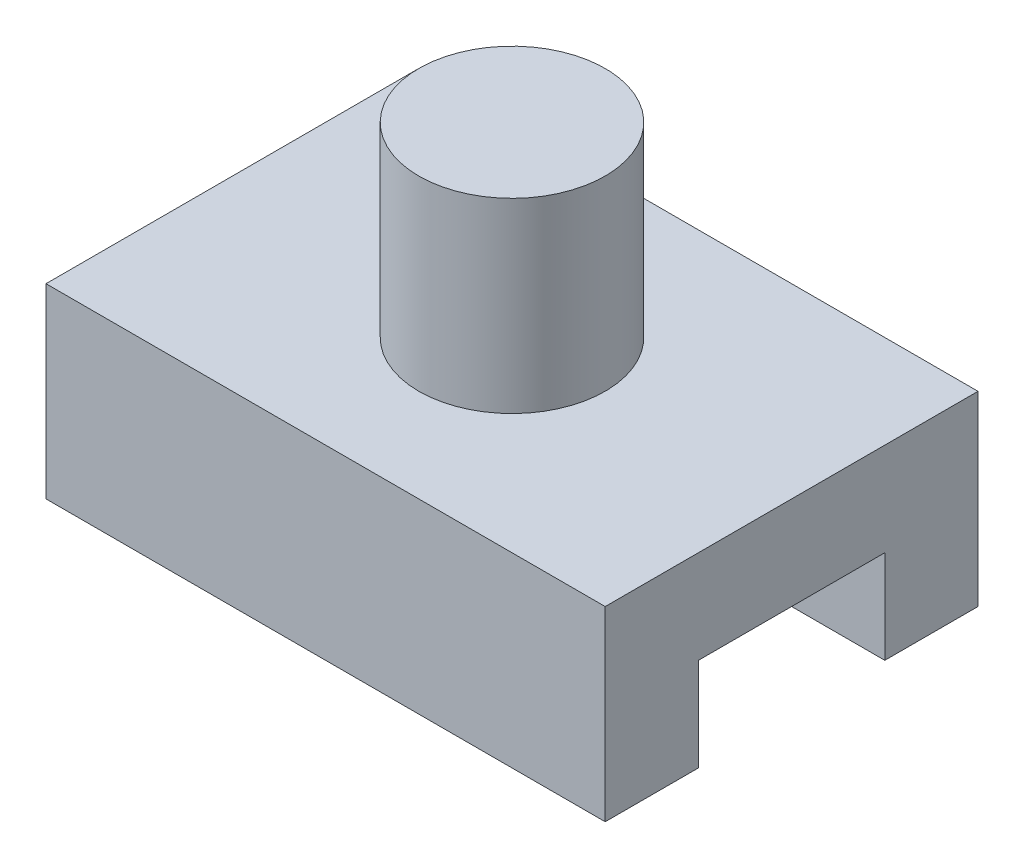
ISO-10303-21;
HEADER;
FILE_DESCRIPTION(('STEP AP214'),'2;1');
FILE_NAME('part.step','',(''),(''),'','','');
FILE_SCHEMA(('AUTOMOTIVE_DESIGN { 1 0 10303 214 1 1 1 1 }'));
ENDSEC;
DATA;
#1=APPLICATION_CONTEXT('core data for automotive mechanical design processes');
#2=APPLICATION_PROTOCOL_DEFINITION('international standard','automotive_design',2000,#1);
#3=PRODUCT_CONTEXT('',#1,'mechanical');
#4=PRODUCT('Part','Part','',(#3));
#5=PRODUCT_RELATED_PRODUCT_CATEGORY('part','',(#4));
#6=PRODUCT_DEFINITION_FORMATION('','',#4);
#7=PRODUCT_DEFINITION_CONTEXT('part definition',#1,'design');
#8=PRODUCT_DEFINITION('design','',#6,#7);
#9=PRODUCT_DEFINITION_SHAPE('','',#8);
#10=(LENGTH_UNIT() NAMED_UNIT(*) SI_UNIT(.MILLI.,.METRE.));
#11=(NAMED_UNIT(*) PLANE_ANGLE_UNIT() SI_UNIT($,.RADIAN.));
#12=(NAMED_UNIT(*) SI_UNIT($,.STERADIAN.) SOLID_ANGLE_UNIT());
#13=UNCERTAINTY_MEASURE_WITH_UNIT(LENGTH_MEASURE(1.E-05),#10,'distance_accuracy_value','');
#14=(GEOMETRIC_REPRESENTATION_CONTEXT(3) GLOBAL_UNCERTAINTY_ASSIGNED_CONTEXT((#13)) GLOBAL_UNIT_ASSIGNED_CONTEXT((#10,
#11,#12)) REPRESENTATION_CONTEXT('',''));
#15=CARTESIAN_POINT('',(0.,0.,0.));
#16=DIRECTION('',(0.,0.,1.));
#17=DIRECTION('',(1.,0.,0.));
#18=AXIS2_PLACEMENT_3D('',#15,#16,#17);
#19=CARTESIAN_POINT('',(0.,0.,0.));
#20=DIRECTION('',(0.,1.,0.));
#21=DIRECTION('',(0.,0.,1.));
#22=AXIS2_PLACEMENT_3D('',#19,#20,#21);
#23=PLANE('',#22);
#24=DIRECTION('',(0.,0.,-1.));
#25=VECTOR('',#24,1.);
#26=CARTESIAN_POINT('',(30.,0.,-20.));
#27=LINE('',#26,#25);
#28=CARTESIAN_POINT('',(30.,0.,-10.));
#29=VERTEX_POINT('',#28);
#30=CARTESIAN_POINT('',(30.,0.,-20.));
#31=VERTEX_POINT('',#30);
#32=EDGE_CURVE('E125',#29,#31,#27,.T.);
#33=ORIENTED_EDGE('',*,*,#32,.F.);
#34=DIRECTION('',(-1.,0.,0.));
#35=VECTOR('',#34,1.);
#36=CARTESIAN_POINT('',(30.,0.,-10.));
#37=LINE('',#36,#35);
#38=CARTESIAN_POINT('',(-30.,0.,-10.));
#39=VERTEX_POINT('',#38);
#40=EDGE_CURVE('E109',#29,#39,#37,.T.);
#41=ORIENTED_EDGE('',*,*,#40,.T.);
#42=DIRECTION('',(0.,0.,1.));
#43=VECTOR('',#42,1.);
#44=CARTESIAN_POINT('',(-30.,0.,-20.));
#45=LINE('',#44,#43);
#46=CARTESIAN_POINT('',(-30.,0.,-20.));
#47=VERTEX_POINT('',#46);
#48=EDGE_CURVE('E143',#47,#39,#45,.T.);
#49=ORIENTED_EDGE('',*,*,#48,.F.);
#50=DIRECTION('',(-1.,0.,0.));
#51=VECTOR('',#50,1.);
#52=CARTESIAN_POINT('',(-30.,0.,-20.));
#53=LINE('',#52,#51);
#54=EDGE_CURVE('E130',#31,#47,#53,.T.);
#55=ORIENTED_EDGE('',*,*,#54,.F.);
#56=EDGE_LOOP('',(#33,#41,#49,#55));
#57=FACE_BOUND('',#56,.T.);
#58=ADVANCED_FACE('F33',(#57),#23,.F.);
#59=CARTESIAN_POINT('',(30.,20.,-20.));
#60=DIRECTION('',(-1.,0.,0.));
#61=DIRECTION('',(0.,0.,1.));
#62=AXIS2_PLACEMENT_3D('',#59,#60,#61);
#63=PLANE('',#62);
#64=DIRECTION('',(0.,0.,-1.));
#65=VECTOR('',#64,1.);
#66=CARTESIAN_POINT('',(30.,10.,-10.));
#67=LINE('',#66,#65);
#68=CARTESIAN_POINT('',(30.,10.,9.99999999999999));
#69=VERTEX_POINT('',#68);
#70=CARTESIAN_POINT('',(30.,10.,-10.));
#71=VERTEX_POINT('',#70);
#72=EDGE_CURVE('E121',#69,#71,#67,.T.);
#73=ORIENTED_EDGE('',*,*,#72,.T.);
#74=DIRECTION('',(0.,-1.,0.));
#75=VECTOR('',#74,1.);
#76=CARTESIAN_POINT('',(30.,0.,-10.));
#77=LINE('',#76,#75);
#78=EDGE_CURVE('E112',#71,#29,#77,.T.);
#79=ORIENTED_EDGE('',*,*,#78,.T.);
#80=ORIENTED_EDGE('',*,*,#32,.T.);
#81=DIRECTION('',(0.,-1.,0.));
#82=VECTOR('',#81,1.);
#83=CARTESIAN_POINT('',(30.,20.,-20.));
#84=LINE('',#83,#82);
#85=CARTESIAN_POINT('',(30.,20.,-20.));
#86=VERTEX_POINT('',#85);
#87=EDGE_CURVE('E37',#86,#31,#84,.T.);
#88=ORIENTED_EDGE('',*,*,#87,.F.);
#89=DIRECTION('',(0.,0.,-1.));
#90=VECTOR('',#89,1.);
#91=CARTESIAN_POINT('',(30.,20.,-20.));
#92=LINE('',#91,#90);
#93=CARTESIAN_POINT('',(30.,20.,20.));
#94=VERTEX_POINT('',#93);
#95=EDGE_CURVE('E146',#94,#86,#92,.T.);
#96=ORIENTED_EDGE('',*,*,#95,.F.);
#97=DIRECTION('',(0.,-1.,0.));
#98=VECTOR('',#97,1.);
#99=CARTESIAN_POINT('',(30.,20.,20.));
#100=LINE('',#99,#98);
#101=CARTESIAN_POINT('',(30.,0.,20.));
#102=VERTEX_POINT('',#101);
#103=EDGE_CURVE('E147',#94,#102,#100,.T.);
#104=ORIENTED_EDGE('',*,*,#103,.T.);
#105=CARTESIAN_POINT('',(30.,0.,9.99999999999999));
#106=VERTEX_POINT('',#105);
#107=EDGE_CURVE('E131',#102,#106,#27,.T.);
#108=ORIENTED_EDGE('',*,*,#107,.T.);
#109=DIRECTION('',(0.,1.,0.));
#110=VECTOR('',#109,1.);
#111=CARTESIAN_POINT('',(30.,0.,9.99999999999999));
#112=LINE('',#111,#110);
#113=EDGE_CURVE('E49',#106,#69,#112,.T.);
#114=ORIENTED_EDGE('',*,*,#113,.T.);
#115=EDGE_LOOP('',(#73,#79,#80,#88,#96,#104,#108,#114));
#116=FACE_BOUND('',#115,.T.);
#117=ADVANCED_FACE('F35',(#116),#63,.F.);
#118=CARTESIAN_POINT('',(-30.,20.,-20.));
#119=DIRECTION('',(0.,0.,1.));
#120=DIRECTION('',(1.,0.,0.));
#121=AXIS2_PLACEMENT_3D('',#118,#119,#120);
#122=PLANE('',#121);
#123=ORIENTED_EDGE('',*,*,#54,.T.);
#124=DIRECTION('',(0.,-1.,0.));
#125=VECTOR('',#124,1.);
#126=CARTESIAN_POINT('',(-30.,20.,-20.));
#127=LINE('',#126,#125);
#128=CARTESIAN_POINT('',(-30.,20.,-20.));
#129=VERTEX_POINT('',#128);
#130=EDGE_CURVE('E150',#129,#47,#127,.T.);
#131=ORIENTED_EDGE('',*,*,#130,.F.);
#132=DIRECTION('',(-1.,0.,0.));
#133=VECTOR('',#132,1.);
#134=CARTESIAN_POINT('',(-30.,20.,-20.));
#135=LINE('',#134,#133);
#136=EDGE_CURVE('E87',#86,#129,#135,.T.);
#137=ORIENTED_EDGE('',*,*,#136,.F.);
#138=ORIENTED_EDGE('',*,*,#87,.T.);
#139=EDGE_LOOP('',(#123,#131,#137,#138));
#140=FACE_BOUND('',#139,.T.);
#141=ADVANCED_FACE('F154',(#140),#122,.F.);
#142=CARTESIAN_POINT('',(-30.,20.,-20.));
#143=DIRECTION('',(1.,0.,0.));
#144=DIRECTION('',(0.,0.,-1.));
#145=AXIS2_PLACEMENT_3D('',#142,#143,#144);
#146=PLANE('',#145);
#147=ORIENTED_EDGE('',*,*,#48,.T.);
#148=DIRECTION('',(0.,-1.,0.));
#149=VECTOR('',#148,1.);
#150=CARTESIAN_POINT('',(-30.,0.,-10.));
#151=LINE('',#150,#149);
#152=CARTESIAN_POINT('',(-30.,10.,-10.));
#153=VERTEX_POINT('',#152);
#154=EDGE_CURVE('E115',#153,#39,#151,.T.);
#155=ORIENTED_EDGE('',*,*,#154,.F.);
#156=DIRECTION('',(0.,0.,-1.));
#157=VECTOR('',#156,1.);
#158=CARTESIAN_POINT('',(-30.,10.,-10.));
#159=LINE('',#158,#157);
#160=CARTESIAN_POINT('',(-30.,10.,10.));
#161=VERTEX_POINT('',#160);
#162=EDGE_CURVE('E128',#161,#153,#159,.T.);
#163=ORIENTED_EDGE('',*,*,#162,.F.);
#164=DIRECTION('',(0.,1.,0.));
#165=VECTOR('',#164,1.);
#166=CARTESIAN_POINT('',(-30.,0.,10.));
#167=LINE('',#166,#165);
#168=CARTESIAN_POINT('',(-30.,0.,10.));
#169=VERTEX_POINT('',#168);
#170=EDGE_CURVE('E194',#169,#161,#167,.T.);
#171=ORIENTED_EDGE('',*,*,#170,.F.);
#172=CARTESIAN_POINT('',(-30.,0.,20.));
#173=VERTEX_POINT('',#172);
#174=EDGE_CURVE('E142',#169,#173,#45,.T.);
#175=ORIENTED_EDGE('',*,*,#174,.T.);
#176=DIRECTION('',(0.,-1.,0.));
#177=VECTOR('',#176,1.);
#178=CARTESIAN_POINT('',(-30.,20.,20.));
#179=LINE('',#178,#177);
#180=CARTESIAN_POINT('',(-30.,20.,20.));
#181=VERTEX_POINT('',#180);
#182=EDGE_CURVE('E149',#181,#173,#179,.T.);
#183=ORIENTED_EDGE('',*,*,#182,.F.);
#184=DIRECTION('',(0.,0.,1.));
#185=VECTOR('',#184,1.);
#186=CARTESIAN_POINT('',(-30.,20.,-20.));
#187=LINE('',#186,#185);
#188=EDGE_CURVE('E158',#129,#181,#187,.T.);
#189=ORIENTED_EDGE('',*,*,#188,.F.);
#190=ORIENTED_EDGE('',*,*,#130,.T.);
#191=EDGE_LOOP('',(#147,#155,#163,#171,#175,#183,#189,#190));
#192=FACE_BOUND('',#191,.T.);
#193=ADVANCED_FACE('F162',(#192),#146,.F.);
#194=CARTESIAN_POINT('',(-30.,20.,20.));
#195=DIRECTION('',(0.,0.,-1.));
#196=DIRECTION('',(-1.,0.,0.));
#197=AXIS2_PLACEMENT_3D('',#194,#195,#196);
#198=PLANE('',#197);
#199=DIRECTION('',(1.,0.,0.));
#200=VECTOR('',#199,1.);
#201=CARTESIAN_POINT('',(-30.,0.,20.));
#202=LINE('',#201,#200);
#203=EDGE_CURVE('E79',#173,#102,#202,.T.);
#204=ORIENTED_EDGE('',*,*,#203,.T.);
#205=ORIENTED_EDGE('',*,*,#103,.F.);
#206=DIRECTION('',(1.,0.,0.));
#207=VECTOR('',#206,1.);
#208=CARTESIAN_POINT('',(-30.,20.,20.));
#209=LINE('',#208,#207);
#210=EDGE_CURVE('E58',#181,#94,#209,.T.);
#211=ORIENTED_EDGE('',*,*,#210,.F.);
#212=ORIENTED_EDGE('',*,*,#182,.T.);
#213=EDGE_LOOP('',(#204,#205,#211,#212));
#214=FACE_BOUND('',#213,.T.);
#215=ADVANCED_FACE('F165',(#214),#198,.F.);
#216=CARTESIAN_POINT('',(0.,20.,0.));
#217=DIRECTION('',(0.,1.,0.));
#218=DIRECTION('',(0.,0.,1.));
#219=AXIS2_PLACEMENT_3D('',#216,#217,#218);
#220=PLANE('',#219);
#221=CARTESIAN_POINT('',(0.,20.,0.));
#222=DIRECTION('',(0.,1.,0.));
#223=DIRECTION('',(0.,0.,1.));
#224=AXIS2_PLACEMENT_3D('',#221,#222,#223);
#225=CIRCLE('',#224,10.);
#226=CARTESIAN_POINT('',(0.,20.,10.));
#227=VERTEX_POINT('',#226);
#228=EDGE_CURVE('E11',#227,#227,#225,.T.);
#229=ORIENTED_EDGE('',*,*,#228,.F.);
#230=EDGE_LOOP('',(#229));
#231=FACE_BOUND('',#230,.T.);
#232=ORIENTED_EDGE('',*,*,#95,.T.);
#233=ORIENTED_EDGE('',*,*,#136,.T.);
#234=ORIENTED_EDGE('',*,*,#188,.T.);
#235=ORIENTED_EDGE('',*,*,#210,.T.);
#236=EDGE_LOOP('',(#232,#233,#234,#235));
#237=FACE_BOUND('',#236,.T.);
#238=ADVANCED_FACE('F161',(#231,#237),#220,.T.);
#239=ORIENTED_EDGE('',*,*,#174,.F.);
#240=DIRECTION('',(-1.,0.,0.));
#241=VECTOR('',#240,1.);
#242=CARTESIAN_POINT('',(30.,0.,9.99999999999999));
#243=LINE('',#242,#241);
#244=EDGE_CURVE('E120',#106,#169,#243,.T.);
#245=ORIENTED_EDGE('',*,*,#244,.F.);
#246=ORIENTED_EDGE('',*,*,#107,.F.);
#247=ORIENTED_EDGE('',*,*,#203,.F.);
#248=EDGE_LOOP('',(#239,#245,#246,#247));
#249=FACE_BOUND('',#248,.T.);
#250=ADVANCED_FACE('F172',(#249),#23,.F.);
#251=CARTESIAN_POINT('',(0.,40.,0.));
#252=DIRECTION('',(0.,-1.,0.));
#253=DIRECTION('',(0.,0.,-1.));
#254=AXIS2_PLACEMENT_3D('',#251,#252,#253);
#255=CYLINDRICAL_SURFACE('',#254,10.);
#256=CARTESIAN_POINT('',(0.,40.,0.));
#257=DIRECTION('',(0.,1.,0.));
#258=DIRECTION('',(0.,0.,1.));
#259=AXIS2_PLACEMENT_3D('',#256,#257,#258);
#260=CIRCLE('',#259,10.);
#261=CARTESIAN_POINT('',(0.,40.,10.));
#262=VERTEX_POINT('',#261);
#263=EDGE_CURVE('E132',#262,#262,#260,.T.);
#264=ORIENTED_EDGE('',*,*,#263,.F.);
#265=EDGE_LOOP('',(#264));
#266=FACE_BOUND('',#265,.T.);
#267=ORIENTED_EDGE('',*,*,#228,.T.);
#268=EDGE_LOOP('',(#267));
#269=FACE_BOUND('',#268,.T.);
#270=ADVANCED_FACE('F182',(#266,#269),#255,.T.);
#271=CARTESIAN_POINT('',(0.,40.,0.));
#272=DIRECTION('',(0.,1.,0.));
#273=DIRECTION('',(0.,0.,1.));
#274=AXIS2_PLACEMENT_3D('',#271,#272,#273);
#275=PLANE('',#274);
#276=ORIENTED_EDGE('',*,*,#263,.T.);
#277=EDGE_LOOP('',(#276));
#278=FACE_BOUND('',#277,.T.);
#279=ADVANCED_FACE('F187',(#278),#275,.T.);
#280=CARTESIAN_POINT('',(30.,0.,-10.));
#281=DIRECTION('',(0.,0.,-1.));
#282=DIRECTION('',(-1.,0.,0.));
#283=AXIS2_PLACEMENT_3D('',#280,#281,#282);
#284=PLANE('',#283);
#285=ORIENTED_EDGE('',*,*,#154,.T.);
#286=ORIENTED_EDGE('',*,*,#40,.F.);
#287=ORIENTED_EDGE('',*,*,#78,.F.);
#288=DIRECTION('',(-1.,0.,0.));
#289=VECTOR('',#288,1.);
#290=CARTESIAN_POINT('',(30.,10.,-10.));
#291=LINE('',#290,#289);
#292=EDGE_CURVE('E136',#71,#153,#291,.T.);
#293=ORIENTED_EDGE('',*,*,#292,.T.);
#294=EDGE_LOOP('',(#285,#286,#287,#293));
#295=FACE_BOUND('',#294,.T.);
#296=ADVANCED_FACE('F111',(#295),#284,.F.);
#297=CARTESIAN_POINT('',(30.,10.,-10.));
#298=DIRECTION('',(0.,1.,0.));
#299=DIRECTION('',(0.,0.,1.));
#300=AXIS2_PLACEMENT_3D('',#297,#298,#299);
#301=PLANE('',#300);
#302=ORIENTED_EDGE('',*,*,#162,.T.);
#303=ORIENTED_EDGE('',*,*,#292,.F.);
#304=ORIENTED_EDGE('',*,*,#72,.F.);
#305=DIRECTION('',(-1.,0.,0.));
#306=VECTOR('',#305,1.);
#307=CARTESIAN_POINT('',(30.,10.,9.99999999999999));
#308=LINE('',#307,#306);
#309=EDGE_CURVE('E200',#69,#161,#308,.T.);
#310=ORIENTED_EDGE('',*,*,#309,.T.);
#311=EDGE_LOOP('',(#302,#303,#304,#310));
#312=FACE_BOUND('',#311,.T.);
#313=ADVANCED_FACE('F205',(#312),#301,.F.);
#314=CARTESIAN_POINT('',(30.,0.,9.99999999999999));
#315=DIRECTION('',(0.,0.,1.));
#316=DIRECTION('',(0.,-1.,0.));
#317=AXIS2_PLACEMENT_3D('',#314,#315,#316);
#318=PLANE('',#317);
#319=ORIENTED_EDGE('',*,*,#170,.T.);
#320=ORIENTED_EDGE('',*,*,#309,.F.);
#321=ORIENTED_EDGE('',*,*,#113,.F.);
#322=ORIENTED_EDGE('',*,*,#244,.T.);
#323=EDGE_LOOP('',(#319,#320,#321,#322));
#324=FACE_BOUND('',#323,.T.);
#325=ADVANCED_FACE('F202',(#324),#318,.F.);
#326=CLOSED_SHELL('',(#58,#117,#141,#193,#215,#238,#250,#270,#279,#296,#313,#325));
#327=MANIFOLD_SOLID_BREP('B2',#326);
#328=ADVANCED_BREP_SHAPE_REPRESENTATION('',(#18,#327),#14);
#329=SHAPE_DEFINITION_REPRESENTATION(#9,#328);
ENDSEC;
END-ISO-10303-21;
